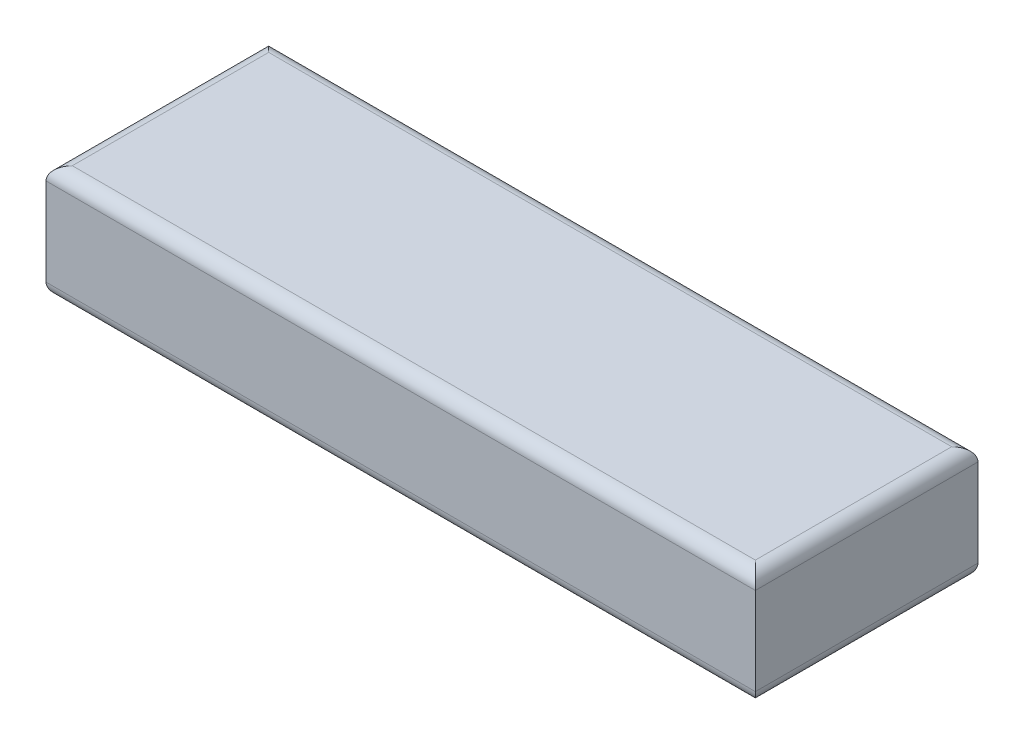
ISO-10303-21;
HEADER;
FILE_DESCRIPTION(('STEP AP214'),'2;1');
FILE_NAME('part.step','',(''),(''),'','','');
FILE_SCHEMA(('AUTOMOTIVE_DESIGN { 1 0 10303 214 1 1 1 1 }'));
ENDSEC;
DATA;
#1=APPLICATION_CONTEXT('core data for automotive mechanical design processes');
#2=APPLICATION_PROTOCOL_DEFINITION('international standard','automotive_design',2000,#1);
#3=PRODUCT_CONTEXT('',#1,'mechanical');
#4=PRODUCT('Part','Part','',(#3));
#5=PRODUCT_RELATED_PRODUCT_CATEGORY('part','',(#4));
#6=PRODUCT_DEFINITION_FORMATION('','',#4);
#7=PRODUCT_DEFINITION_CONTEXT('part definition',#1,'design');
#8=PRODUCT_DEFINITION('design','',#6,#7);
#9=PRODUCT_DEFINITION_SHAPE('','',#8);
#10=(LENGTH_UNIT() NAMED_UNIT(*) SI_UNIT(.MILLI.,.METRE.));
#11=(NAMED_UNIT(*) PLANE_ANGLE_UNIT() SI_UNIT($,.RADIAN.));
#12=(NAMED_UNIT(*) SI_UNIT($,.STERADIAN.) SOLID_ANGLE_UNIT());
#13=UNCERTAINTY_MEASURE_WITH_UNIT(LENGTH_MEASURE(1.E-05),#10,'distance_accuracy_value','');
#14=(GEOMETRIC_REPRESENTATION_CONTEXT(3) GLOBAL_UNCERTAINTY_ASSIGNED_CONTEXT((#13)) GLOBAL_UNIT_ASSIGNED_CONTEXT((#10,
#11,#12)) REPRESENTATION_CONTEXT('',''));
#15=CARTESIAN_POINT('',(0.,0.,0.));
#16=DIRECTION('',(0.,0.,1.));
#17=DIRECTION('',(1.,0.,0.));
#18=AXIS2_PLACEMENT_3D('',#15,#16,#17);
#19=CARTESIAN_POINT('',(-2.70634920634921,22.,52.4148197575396));
#20=DIRECTION('',(1.,0.,0.));
#21=DIRECTION('',(0.,0.,-1.));
#22=AXIS2_PLACEMENT_3D('',#19,#20,#21);
#23=PLANE('',#22);
#24=DIRECTION('',(0.,-1.,0.));
#25=VECTOR('',#24,1.);
#26=CARTESIAN_POINT('',(-2.70634920634921,22.,9.41481975753958));
#27=LINE('',#26,#25);
#28=CARTESIAN_POINT('',(-2.70634920634921,19.46,9.41481975753958));
#29=VERTEX_POINT('',#28);
#30=CARTESIAN_POINT('',(-2.70634920634921,2.54,9.41481975753958));
#31=VERTEX_POINT('',#30);
#32=EDGE_CURVE('E142',#29,#31,#27,.T.);
#33=ORIENTED_EDGE('',*,*,#32,.T.);
#34=DIRECTION('',(0.,0.,1.));
#35=VECTOR('',#34,1.);
#36=CARTESIAN_POINT('',(-2.70634920634921,2.54,52.4148197575396));
#37=LINE('',#36,#35);
#38=CARTESIAN_POINT('',(-2.70634920634921,2.54,52.4148197575396));
#39=VERTEX_POINT('',#38);
#40=EDGE_CURVE('E151',#31,#39,#37,.T.);
#41=ORIENTED_EDGE('',*,*,#40,.T.);
#42=DIRECTION('',(0.,-1.,0.));
#43=VECTOR('',#42,1.);
#44=CARTESIAN_POINT('',(-2.70634920634921,22.,52.4148197575396));
#45=LINE('',#44,#43);
#46=CARTESIAN_POINT('',(-2.70634920634921,19.46,52.4148197575396));
#47=VERTEX_POINT('',#46);
#48=EDGE_CURVE('E120',#47,#39,#45,.T.);
#49=ORIENTED_EDGE('',*,*,#48,.F.);
#50=DIRECTION('',(0.,0.,1.));
#51=VECTOR('',#50,1.);
#52=CARTESIAN_POINT('',(-2.70634920634921,19.46,52.4148197575396));
#53=LINE('',#52,#51);
#54=EDGE_CURVE('E153',#47,#29,#53,.F.);
#55=ORIENTED_EDGE('',*,*,#54,.T.);
#56=EDGE_LOOP('',(#33,#41,#49,#55));
#57=FACE_BOUND('',#56,.T.);
#58=ADVANCED_FACE('F33',(#57),#23,.F.);
#59=CARTESIAN_POINT('',(-2.70634920634921,22.,52.4148197575396));
#60=DIRECTION('',(0.,0.,-1.));
#61=DIRECTION('',(-1.,0.,0.));
#62=AXIS2_PLACEMENT_3D('',#59,#60,#61);
#63=PLANE('',#62);
#64=ORIENTED_EDGE('',*,*,#48,.T.);
#65=DIRECTION('',(1.,0.,0.));
#66=VECTOR('',#65,1.);
#67=CARTESIAN_POINT('',(134.293650793651,2.54,52.4148197575396));
#68=LINE('',#67,#66);
#69=CARTESIAN_POINT('',(134.293650793651,2.54,52.4148197575396));
#70=VERTEX_POINT('',#69);
#71=EDGE_CURVE('E119',#39,#70,#68,.T.);
#72=ORIENTED_EDGE('',*,*,#71,.T.);
#73=DIRECTION('',(0.,-1.,0.));
#74=VECTOR('',#73,1.);
#75=CARTESIAN_POINT('',(134.293650793651,22.,52.4148197575396));
#76=LINE('',#75,#74);
#77=CARTESIAN_POINT('',(134.293650793651,19.46,52.4148197575396));
#78=VERTEX_POINT('',#77);
#79=EDGE_CURVE('E102',#78,#70,#76,.T.);
#80=ORIENTED_EDGE('',*,*,#79,.F.);
#81=DIRECTION('',(1.,0.,0.));
#82=VECTOR('',#81,1.);
#83=CARTESIAN_POINT('',(-2.70634920634921,19.46,52.4148197575396));
#84=LINE('',#83,#82);
#85=EDGE_CURVE('E116',#78,#47,#84,.F.);
#86=ORIENTED_EDGE('',*,*,#85,.T.);
#87=EDGE_LOOP('',(#64,#72,#80,#86));
#88=FACE_BOUND('',#87,.T.);
#89=ADVANCED_FACE('F115',(#88),#63,.F.);
#90=CARTESIAN_POINT('',(134.293650793651,22.,52.4148197575396));
#91=DIRECTION('',(-1.,0.,0.));
#92=DIRECTION('',(0.,0.,1.));
#93=AXIS2_PLACEMENT_3D('',#90,#91,#92);
#94=PLANE('',#93);
#95=ORIENTED_EDGE('',*,*,#79,.T.);
#96=DIRECTION('',(0.,0.,-1.));
#97=VECTOR('',#96,1.);
#98=CARTESIAN_POINT('',(134.293650793651,2.54,9.41481975753958));
#99=LINE('',#98,#97);
#100=CARTESIAN_POINT('',(134.293650793651,2.54,9.41481975753958));
#101=VERTEX_POINT('',#100);
#102=EDGE_CURVE('E108',#70,#101,#99,.T.);
#103=ORIENTED_EDGE('',*,*,#102,.T.);
#104=DIRECTION('',(0.,-1.,0.));
#105=VECTOR('',#104,1.);
#106=CARTESIAN_POINT('',(134.293650793651,22.,9.41481975753958));
#107=LINE('',#106,#105);
#108=CARTESIAN_POINT('',(134.293650793651,19.46,9.41481975753958));
#109=VERTEX_POINT('',#108);
#110=EDGE_CURVE('E104',#109,#101,#107,.T.);
#111=ORIENTED_EDGE('',*,*,#110,.F.);
#112=DIRECTION('',(0.,0.,-1.));
#113=VECTOR('',#112,1.);
#114=CARTESIAN_POINT('',(134.293650793651,19.46,52.4148197575396));
#115=LINE('',#114,#113);
#116=EDGE_CURVE('E99',#109,#78,#115,.F.);
#117=ORIENTED_EDGE('',*,*,#116,.T.);
#118=EDGE_LOOP('',(#95,#103,#111,#117));
#119=FACE_BOUND('',#118,.T.);
#120=ADVANCED_FACE('F101',(#119),#94,.F.);
#121=CARTESIAN_POINT('',(-2.70634920634921,22.,9.41481975753958));
#122=DIRECTION('',(0.,0.,1.));
#123=DIRECTION('',(1.,0.,0.));
#124=AXIS2_PLACEMENT_3D('',#121,#122,#123);
#125=PLANE('',#124);
#126=ORIENTED_EDGE('',*,*,#110,.T.);
#127=DIRECTION('',(-1.,0.,0.));
#128=VECTOR('',#127,1.);
#129=CARTESIAN_POINT('',(-2.70634920634921,2.54,9.41481975753958));
#130=LINE('',#129,#128);
#131=EDGE_CURVE('E155',#101,#31,#130,.T.);
#132=ORIENTED_EDGE('',*,*,#131,.T.);
#133=ORIENTED_EDGE('',*,*,#32,.F.);
#134=DIRECTION('',(-1.,0.,0.));
#135=VECTOR('',#134,1.);
#136=CARTESIAN_POINT('',(-2.70634920634921,19.46,9.41481975753958));
#137=LINE('',#136,#135);
#138=EDGE_CURVE('E157',#29,#109,#137,.F.);
#139=ORIENTED_EDGE('',*,*,#138,.T.);
#140=EDGE_LOOP('',(#126,#132,#133,#139));
#141=FACE_BOUND('',#140,.T.);
#142=ADVANCED_FACE('F195',(#141),#125,.F.);
#143=CARTESIAN_POINT('',(0.,22.,0.));
#144=DIRECTION('',(0.,-1.,0.));
#145=DIRECTION('',(0.,0.,-1.));
#146=AXIS2_PLACEMENT_3D('',#143,#144,#145);
#147=PLANE('',#146);
#148=DIRECTION('',(0.,0.,-1.));
#149=VECTOR('',#148,1.);
#150=CARTESIAN_POINT('',(131.753650793651,22.,0.));
#151=LINE('',#150,#149);
#152=CARTESIAN_POINT('',(131.753650793651,22.,49.8748197575396));
#153=VERTEX_POINT('',#152);
#154=CARTESIAN_POINT('',(131.753650793651,22.,11.9548197575396));
#155=VERTEX_POINT('',#154);
#156=EDGE_CURVE('E42',#153,#155,#151,.T.);
#157=ORIENTED_EDGE('',*,*,#156,.T.);
#158=DIRECTION('',(-1.,0.,0.));
#159=VECTOR('',#158,1.);
#160=CARTESIAN_POINT('',(0.,22.,11.9548197575396));
#161=LINE('',#160,#159);
#162=CARTESIAN_POINT('',(-0.166349206349206,22.,11.9548197575396));
#163=VERTEX_POINT('',#162);
#164=EDGE_CURVE('E11',#155,#163,#161,.T.);
#165=ORIENTED_EDGE('',*,*,#164,.T.);
#166=DIRECTION('',(0.,0.,1.));
#167=VECTOR('',#166,1.);
#168=CARTESIAN_POINT('',(-0.166349206349206,22.,0.));
#169=LINE('',#168,#167);
#170=CARTESIAN_POINT('',(-0.166349206349206,22.,49.8748197575396));
#171=VERTEX_POINT('',#170);
#172=EDGE_CURVE('E149',#163,#171,#169,.T.);
#173=ORIENTED_EDGE('',*,*,#172,.T.);
#174=DIRECTION('',(1.,0.,0.));
#175=VECTOR('',#174,1.);
#176=CARTESIAN_POINT('',(0.,22.,49.8748197575396));
#177=LINE('',#176,#175);
#178=EDGE_CURVE('E53',#171,#153,#177,.T.);
#179=ORIENTED_EDGE('',*,*,#178,.T.);
#180=EDGE_LOOP('',(#157,#165,#173,#179));
#181=FACE_BOUND('',#180,.T.);
#182=ADVANCED_FACE('F201',(#181),#147,.F.);
#183=CARTESIAN_POINT('',(0.,0.,0.));
#184=DIRECTION('',(0.,-1.,0.));
#185=DIRECTION('',(0.,0.,-1.));
#186=AXIS2_PLACEMENT_3D('',#183,#184,#185);
#187=PLANE('',#186);
#188=DIRECTION('',(0.,0.,-1.));
#189=VECTOR('',#188,1.);
#190=CARTESIAN_POINT('',(131.753650793651,0.,52.4148197575396));
#191=LINE('',#190,#189);
#192=CARTESIAN_POINT('',(131.753650793651,0.,11.9548197575396));
#193=VERTEX_POINT('',#192);
#194=CARTESIAN_POINT('',(131.753650793651,0.,49.8748197575396));
#195=VERTEX_POINT('',#194);
#196=EDGE_CURVE('E162',#193,#195,#191,.F.);
#197=ORIENTED_EDGE('',*,*,#196,.T.);
#198=DIRECTION('',(1.,0.,0.));
#199=VECTOR('',#198,1.);
#200=CARTESIAN_POINT('',(-2.70634920634921,0.,49.8748197575396));
#201=LINE('',#200,#199);
#202=CARTESIAN_POINT('',(-0.166349206349206,0.,49.8748197575396));
#203=VERTEX_POINT('',#202);
#204=EDGE_CURVE('E109',#195,#203,#201,.F.);
#205=ORIENTED_EDGE('',*,*,#204,.T.);
#206=DIRECTION('',(0.,0.,1.));
#207=VECTOR('',#206,1.);
#208=CARTESIAN_POINT('',(-0.166349206349206,0.,9.41481975753958));
#209=LINE('',#208,#207);
#210=CARTESIAN_POINT('',(-0.166349206349206,0.,11.9548197575396));
#211=VERTEX_POINT('',#210);
#212=EDGE_CURVE('E166',#203,#211,#209,.F.);
#213=ORIENTED_EDGE('',*,*,#212,.T.);
#214=DIRECTION('',(-1.,0.,0.));
#215=VECTOR('',#214,1.);
#216=CARTESIAN_POINT('',(134.293650793651,0.,11.9548197575396));
#217=LINE('',#216,#215);
#218=EDGE_CURVE('E164',#211,#193,#217,.F.);
#219=ORIENTED_EDGE('',*,*,#218,.T.);
#220=EDGE_LOOP('',(#197,#205,#213,#219));
#221=FACE_BOUND('',#220,.T.);
#222=ADVANCED_FACE('F203',(#221),#187,.T.);
#223=CARTESIAN_POINT('',(-2.70634920634921,2.54,11.9548197575396));
#224=DIRECTION('',(1.,0.,0.));
#225=DIRECTION('',(0.,0.,-1.));
#226=AXIS2_PLACEMENT_3D('',#223,#224,#225);
#227=CYLINDRICAL_SURFACE('',#226,2.54);
#228=CARTESIAN_POINT('',(131.753650793651,2.54,11.9548197575396));
#229=DIRECTION('',(0.707106781186547,0.,0.707106781186547));
#230=DIRECTION('',(0.707106781186547,0.,-0.707106781186547));
#231=AXIS2_PLACEMENT_3D('',#228,#229,#230);
#232=ELLIPSE('',#231,3.59210244842766,2.54);
#233=EDGE_CURVE('E143',#193,#101,#232,.T.);
#234=ORIENTED_EDGE('',*,*,#233,.F.);
#235=ORIENTED_EDGE('',*,*,#218,.F.);
#236=CARTESIAN_POINT('',(-0.166349206349206,2.54,11.9548197575396));
#237=DIRECTION('',(0.707106781186547,0.,-0.707106781186547));
#238=DIRECTION('',(-0.707106781186547,0.,-0.707106781186547));
#239=AXIS2_PLACEMENT_3D('',#236,#237,#238);
#240=ELLIPSE('',#239,3.59210244842766,2.54);
#241=EDGE_CURVE('E139',#31,#211,#240,.F.);
#242=ORIENTED_EDGE('',*,*,#241,.F.);
#243=ORIENTED_EDGE('',*,*,#131,.F.);
#244=EDGE_LOOP('',(#234,#235,#242,#243));
#245=FACE_BOUND('',#244,.T.);
#246=ADVANCED_FACE('F182',(#245),#227,.T.);
#247=CARTESIAN_POINT('',(-0.166349206349206,2.54,52.4148197575396));
#248=DIRECTION('',(0.,0.,-1.));
#249=DIRECTION('',(-1.,0.,0.));
#250=AXIS2_PLACEMENT_3D('',#247,#248,#249);
#251=CYLINDRICAL_SURFACE('',#250,2.54);
#252=ORIENTED_EDGE('',*,*,#241,.T.);
#253=ORIENTED_EDGE('',*,*,#212,.F.);
#254=CARTESIAN_POINT('',(-0.166349206349206,2.54,49.8748197575396));
#255=DIRECTION('',(-0.707106781186547,0.,-0.707106781186547));
#256=DIRECTION('',(0.707106781186547,0.,-0.707106781186547));
#257=AXIS2_PLACEMENT_3D('',#254,#255,#256);
#258=ELLIPSE('',#257,3.59210244842766,2.54);
#259=EDGE_CURVE('E130',#39,#203,#258,.F.);
#260=ORIENTED_EDGE('',*,*,#259,.F.);
#261=ORIENTED_EDGE('',*,*,#40,.F.);
#262=EDGE_LOOP('',(#252,#253,#260,#261));
#263=FACE_BOUND('',#262,.T.);
#264=ADVANCED_FACE('F186',(#263),#251,.T.);
#265=CARTESIAN_POINT('',(131.753650793651,2.54,52.4148197575396));
#266=DIRECTION('',(0.,0.,1.));
#267=DIRECTION('',(1.,0.,0.));
#268=AXIS2_PLACEMENT_3D('',#265,#266,#267);
#269=CYLINDRICAL_SURFACE('',#268,2.54);
#270=ORIENTED_EDGE('',*,*,#233,.T.);
#271=ORIENTED_EDGE('',*,*,#102,.F.);
#272=CARTESIAN_POINT('',(131.753650793651,2.54,49.8748197575396));
#273=DIRECTION('',(-0.707106781186547,0.,0.707106781186547));
#274=DIRECTION('',(0.707106781186547,0.,0.707106781186547));
#275=AXIS2_PLACEMENT_3D('',#272,#273,#274);
#276=ELLIPSE('',#275,3.59210244842766,2.54);
#277=EDGE_CURVE('E129',#195,#70,#276,.T.);
#278=ORIENTED_EDGE('',*,*,#277,.F.);
#279=ORIENTED_EDGE('',*,*,#196,.F.);
#280=EDGE_LOOP('',(#270,#271,#278,#279));
#281=FACE_BOUND('',#280,.T.);
#282=ADVANCED_FACE('F194',(#281),#269,.T.);
#283=CARTESIAN_POINT('',(-2.70634920634921,2.54,49.8748197575396));
#284=DIRECTION('',(-1.,0.,0.));
#285=DIRECTION('',(0.,0.,1.));
#286=AXIS2_PLACEMENT_3D('',#283,#284,#285);
#287=CYLINDRICAL_SURFACE('',#286,2.54);
#288=ORIENTED_EDGE('',*,*,#259,.T.);
#289=ORIENTED_EDGE('',*,*,#204,.F.);
#290=ORIENTED_EDGE('',*,*,#277,.T.);
#291=ORIENTED_EDGE('',*,*,#71,.F.);
#292=EDGE_LOOP('',(#288,#289,#290,#291));
#293=FACE_BOUND('',#292,.T.);
#294=ADVANCED_FACE('F189',(#293),#287,.T.);
#295=CARTESIAN_POINT('',(0.,19.46,49.8748197575396));
#296=DIRECTION('',(1.,0.,0.));
#297=DIRECTION('',(0.,0.,-1.));
#298=AXIS2_PLACEMENT_3D('',#295,#296,#297);
#299=CYLINDRICAL_SURFACE('',#298,2.54);
#300=CARTESIAN_POINT('',(-0.166349206349206,19.46,49.8748197575396));
#301=DIRECTION('',(0.707106781186547,0.,0.707106781186547));
#302=DIRECTION('',(-0.707106781186547,0.,0.707106781186547));
#303=AXIS2_PLACEMENT_3D('',#300,#301,#302);
#304=ELLIPSE('',#303,3.59210244842766,2.54);
#305=EDGE_CURVE('E125',#47,#171,#304,.F.);
#306=ORIENTED_EDGE('',*,*,#305,.F.);
#307=ORIENTED_EDGE('',*,*,#85,.F.);
#308=CARTESIAN_POINT('',(131.753650793651,19.46,49.8748197575396));
#309=DIRECTION('',(0.707106781186547,0.,-0.707106781186547));
#310=DIRECTION('',(0.707106781186547,0.,0.707106781186547));
#311=AXIS2_PLACEMENT_3D('',#308,#309,#310);
#312=ELLIPSE('',#311,3.59210244842766,2.54);
#313=EDGE_CURVE('E37',#153,#78,#312,.T.);
#314=ORIENTED_EDGE('',*,*,#313,.F.);
#315=ORIENTED_EDGE('',*,*,#178,.F.);
#316=EDGE_LOOP('',(#306,#307,#314,#315));
#317=FACE_BOUND('',#316,.T.);
#318=ADVANCED_FACE('F35',(#317),#299,.T.);
#319=CARTESIAN_POINT('',(131.753650793651,19.46,0.));
#320=DIRECTION('',(0.,0.,-1.));
#321=DIRECTION('',(-1.,0.,0.));
#322=AXIS2_PLACEMENT_3D('',#319,#320,#321);
#323=CYLINDRICAL_SURFACE('',#322,2.54);
#324=ORIENTED_EDGE('',*,*,#313,.T.);
#325=ORIENTED_EDGE('',*,*,#116,.F.);
#326=CARTESIAN_POINT('',(131.753650793651,19.46,11.9548197575396));
#327=DIRECTION('',(-0.707106781186547,0.,-0.707106781186547));
#328=DIRECTION('',(0.707106781186547,0.,-0.707106781186547));
#329=AXIS2_PLACEMENT_3D('',#326,#327,#328);
#330=ELLIPSE('',#329,3.59210244842766,2.54);
#331=EDGE_CURVE('E132',#155,#109,#330,.T.);
#332=ORIENTED_EDGE('',*,*,#331,.F.);
#333=ORIENTED_EDGE('',*,*,#156,.F.);
#334=EDGE_LOOP('',(#324,#325,#332,#333));
#335=FACE_BOUND('',#334,.T.);
#336=ADVANCED_FACE('F128',(#335),#323,.T.);
#337=CARTESIAN_POINT('',(-0.166349206349206,19.46,0.));
#338=DIRECTION('',(0.,0.,1.));
#339=DIRECTION('',(1.,0.,0.));
#340=AXIS2_PLACEMENT_3D('',#337,#338,#339);
#341=CYLINDRICAL_SURFACE('',#340,2.54);
#342=ORIENTED_EDGE('',*,*,#305,.T.);
#343=ORIENTED_EDGE('',*,*,#172,.F.);
#344=CARTESIAN_POINT('',(-0.166349206349206,19.46,11.9548197575396));
#345=DIRECTION('',(-0.707106781186547,0.,0.707106781186547));
#346=DIRECTION('',(0.707106781186547,0.,0.707106781186547));
#347=AXIS2_PLACEMENT_3D('',#344,#345,#346);
#348=ELLIPSE('',#347,3.59210244842766,2.54);
#349=EDGE_CURVE('E135',#29,#163,#348,.F.);
#350=ORIENTED_EDGE('',*,*,#349,.F.);
#351=ORIENTED_EDGE('',*,*,#54,.F.);
#352=EDGE_LOOP('',(#342,#343,#350,#351));
#353=FACE_BOUND('',#352,.T.);
#354=ADVANCED_FACE('F200',(#353),#341,.T.);
#355=CARTESIAN_POINT('',(0.,19.46,11.9548197575396));
#356=DIRECTION('',(-1.,0.,0.));
#357=DIRECTION('',(0.,0.,1.));
#358=AXIS2_PLACEMENT_3D('',#355,#356,#357);
#359=CYLINDRICAL_SURFACE('',#358,2.54);
#360=ORIENTED_EDGE('',*,*,#331,.T.);
#361=ORIENTED_EDGE('',*,*,#138,.F.);
#362=ORIENTED_EDGE('',*,*,#349,.T.);
#363=ORIENTED_EDGE('',*,*,#164,.F.);
#364=EDGE_LOOP('',(#360,#361,#362,#363));
#365=FACE_BOUND('',#364,.T.);
#366=ADVANCED_FACE('F198',(#365),#359,.T.);
#367=CLOSED_SHELL('',(#58,#89,#120,#142,#182,#222,#246,#264,#282,#294,#318,#336,#354,#366));
#368=MANIFOLD_SOLID_BREP('B2',#367);
#369=ADVANCED_BREP_SHAPE_REPRESENTATION('',(#18,#368),#14);
#370=SHAPE_DEFINITION_REPRESENTATION(#9,#369);
ENDSEC;
END-ISO-10303-21;
